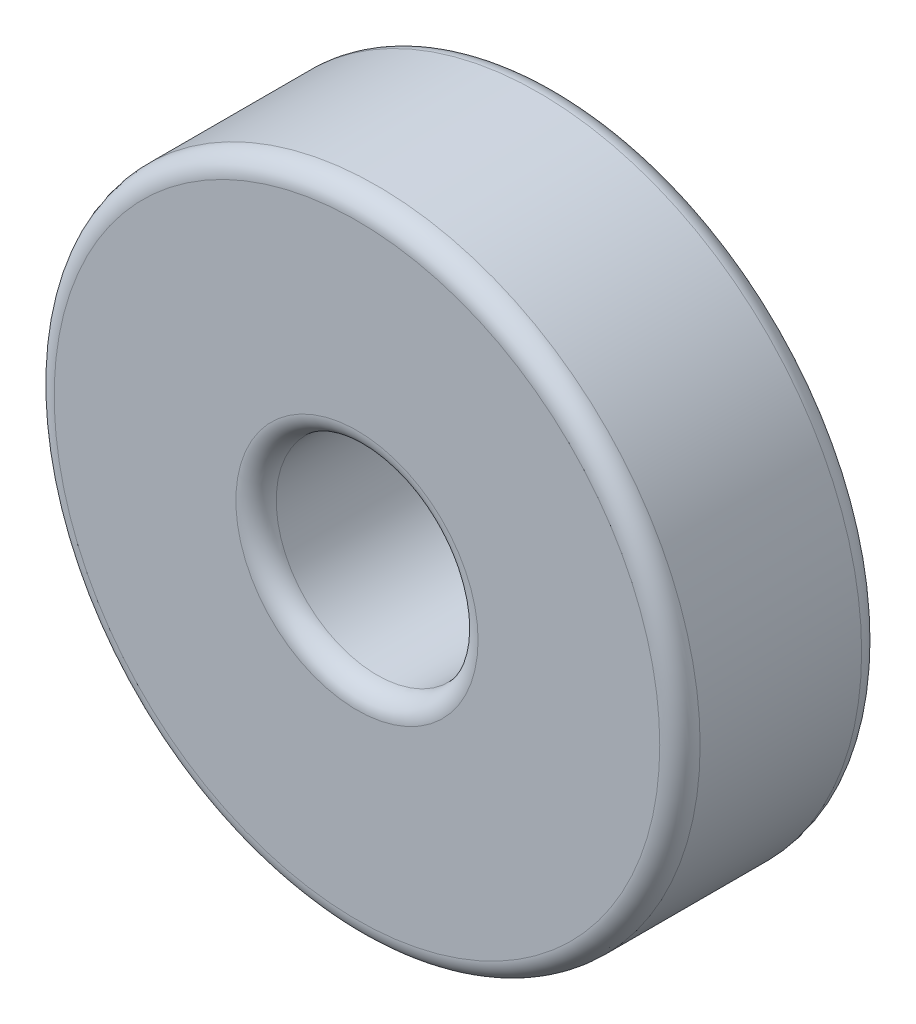
ISO-10303-21;
HEADER;
FILE_DESCRIPTION(('STEP AP214'),'2;1');
FILE_NAME('part.step','',(''),(''),'','','');
FILE_SCHEMA(('AUTOMOTIVE_DESIGN { 1 0 10303 214 1 1 1 1 }'));
ENDSEC;
DATA;
#1=APPLICATION_CONTEXT('core data for automotive mechanical design processes');
#2=APPLICATION_PROTOCOL_DEFINITION('international standard','automotive_design',2000,#1);
#3=PRODUCT_CONTEXT('',#1,'mechanical');
#4=PRODUCT('Part','Part','',(#3));
#5=PRODUCT_RELATED_PRODUCT_CATEGORY('part','',(#4));
#6=PRODUCT_DEFINITION_FORMATION('','',#4);
#7=PRODUCT_DEFINITION_CONTEXT('part definition',#1,'design');
#8=PRODUCT_DEFINITION('design','',#6,#7);
#9=PRODUCT_DEFINITION_SHAPE('','',#8);
#10=(LENGTH_UNIT() NAMED_UNIT(*) SI_UNIT(.MILLI.,.METRE.));
#11=(NAMED_UNIT(*) PLANE_ANGLE_UNIT() SI_UNIT($,.RADIAN.));
#12=(NAMED_UNIT(*) SI_UNIT($,.STERADIAN.) SOLID_ANGLE_UNIT());
#13=UNCERTAINTY_MEASURE_WITH_UNIT(LENGTH_MEASURE(1.E-05),#10,'distance_accuracy_value','');
#14=(GEOMETRIC_REPRESENTATION_CONTEXT(3) GLOBAL_UNCERTAINTY_ASSIGNED_CONTEXT((#13)) GLOBAL_UNIT_ASSIGNED_CONTEXT((#10,
#11,#12)) REPRESENTATION_CONTEXT('',''));
#15=CARTESIAN_POINT('',(0.,0.,0.));
#16=DIRECTION('',(0.,0.,1.));
#17=DIRECTION('',(1.,0.,0.));
#18=AXIS2_PLACEMENT_3D('',#15,#16,#17);
#19=CARTESIAN_POINT('',(0.,0.,5.));
#20=DIRECTION('',(0.,0.,1.));
#21=DIRECTION('',(1.,0.,0.));
#22=AXIS2_PLACEMENT_3D('',#19,#20,#21);
#23=PLANE('',#22);
#24=CARTESIAN_POINT('',(0.,0.,5.));
#25=DIRECTION('',(0.,0.,1.));
#26=DIRECTION('',(1.,0.,0.));
#27=AXIS2_PLACEMENT_3D('',#24,#25,#26);
#28=CIRCLE('',#27,3.);
#29=CARTESIAN_POINT('',(3.,0.,5.));
#30=VERTEX_POINT('',#29);
#31=EDGE_CURVE('E10',#30,#30,#28,.F.);
#32=ORIENTED_EDGE('',*,*,#31,.T.);
#33=EDGE_LOOP('',(#32));
#34=FACE_BOUND('',#33,.T.);
#35=CARTESIAN_POINT('',(0.,0.,5.));
#36=DIRECTION('',(0.,0.,1.));
#37=DIRECTION('',(1.,0.,0.));
#38=AXIS2_PLACEMENT_3D('',#35,#36,#37);
#39=CIRCLE('',#38,7.5);
#40=CARTESIAN_POINT('',(7.5,0.,5.));
#41=VERTEX_POINT('',#40);
#42=EDGE_CURVE('E50',#41,#41,#39,.T.);
#43=ORIENTED_EDGE('',*,*,#42,.T.);
#44=EDGE_LOOP('',(#43));
#45=FACE_BOUND('',#44,.T.);
#46=ADVANCED_FACE('F42',(#34,#45),#23,.T.);
#47=CARTESIAN_POINT('',(0.,0.,0.));
#48=DIRECTION('',(0.,0.,1.));
#49=DIRECTION('',(1.,0.,0.));
#50=AXIS2_PLACEMENT_3D('',#47,#48,#49);
#51=PLANE('',#50);
#52=CARTESIAN_POINT('',(0.,0.,0.));
#53=DIRECTION('',(0.,0.,1.));
#54=DIRECTION('',(1.,0.,0.));
#55=AXIS2_PLACEMENT_3D('',#52,#53,#54);
#56=CIRCLE('',#55,3.);
#57=CARTESIAN_POINT('',(3.,0.,0.));
#58=VERTEX_POINT('',#57);
#59=EDGE_CURVE('E74',#58,#58,#56,.T.);
#60=ORIENTED_EDGE('',*,*,#59,.T.);
#61=EDGE_LOOP('',(#60));
#62=FACE_BOUND('',#61,.T.);
#63=CARTESIAN_POINT('',(0.,0.,0.));
#64=DIRECTION('',(0.,0.,1.));
#65=DIRECTION('',(1.,0.,0.));
#66=AXIS2_PLACEMENT_3D('',#63,#64,#65);
#67=CIRCLE('',#66,7.5);
#68=CARTESIAN_POINT('',(7.5,0.,0.));
#69=VERTEX_POINT('',#68);
#70=EDGE_CURVE('E78',#69,#69,#67,.F.);
#71=ORIENTED_EDGE('',*,*,#70,.T.);
#72=EDGE_LOOP('',(#71));
#73=FACE_BOUND('',#72,.T.);
#74=ADVANCED_FACE('F83',(#62,#73),#51,.F.);
#75=CARTESIAN_POINT('',(0.,0.,5.));
#76=DIRECTION('',(0.,0.,-1.));
#77=DIRECTION('',(-1.,0.,0.));
#78=AXIS2_PLACEMENT_3D('',#75,#76,#77);
#79=CYLINDRICAL_SURFACE('',#78,8.);
#80=CARTESIAN_POINT('',(0.,0.,0.5));
#81=DIRECTION('',(0.,0.,1.));
#82=DIRECTION('',(1.,0.,0.));
#83=AXIS2_PLACEMENT_3D('',#80,#81,#82);
#84=CIRCLE('',#83,8.);
#85=CARTESIAN_POINT('',(8.,0.,0.5));
#86=VERTEX_POINT('',#85);
#87=EDGE_CURVE('E55',#86,#86,#84,.T.);
#88=ORIENTED_EDGE('',*,*,#87,.T.);
#89=EDGE_LOOP('',(#88));
#90=FACE_BOUND('',#89,.T.);
#91=CARTESIAN_POINT('',(0.,0.,4.5));
#92=DIRECTION('',(0.,0.,1.));
#93=DIRECTION('',(1.,0.,0.));
#94=AXIS2_PLACEMENT_3D('',#91,#92,#93);
#95=CIRCLE('',#94,8.);
#96=CARTESIAN_POINT('',(8.,0.,4.5));
#97=VERTEX_POINT('',#96);
#98=EDGE_CURVE('E60',#97,#97,#95,.F.);
#99=ORIENTED_EDGE('',*,*,#98,.T.);
#100=EDGE_LOOP('',(#99));
#101=FACE_BOUND('',#100,.T.);
#102=ADVANCED_FACE('F93',(#90,#101),#79,.T.);
#103=CARTESIAN_POINT('',(0.,0.,5.));
#104=DIRECTION('',(0.,0.,-1.));
#105=DIRECTION('',(-1.,0.,0.));
#106=AXIS2_PLACEMENT_3D('',#103,#104,#105);
#107=CYLINDRICAL_SURFACE('',#106,2.5);
#108=CARTESIAN_POINT('',(0.,0.,0.5));
#109=DIRECTION('',(0.,0.,1.));
#110=DIRECTION('',(1.,0.,0.));
#111=AXIS2_PLACEMENT_3D('',#108,#109,#110);
#112=CIRCLE('',#111,2.5);
#113=CARTESIAN_POINT('',(2.5,0.,0.5));
#114=VERTEX_POINT('',#113);
#115=EDGE_CURVE('E66',#114,#114,#112,.F.);
#116=ORIENTED_EDGE('',*,*,#115,.T.);
#117=EDGE_LOOP('',(#116));
#118=FACE_BOUND('',#117,.T.);
#119=CARTESIAN_POINT('',(0.,0.,4.5));
#120=DIRECTION('',(0.,0.,1.));
#121=DIRECTION('',(1.,0.,0.));
#122=AXIS2_PLACEMENT_3D('',#119,#120,#121);
#123=CIRCLE('',#122,2.5);
#124=CARTESIAN_POINT('',(2.5,0.,4.5));
#125=VERTEX_POINT('',#124);
#126=EDGE_CURVE('E70',#125,#125,#123,.T.);
#127=ORIENTED_EDGE('',*,*,#126,.T.);
#128=EDGE_LOOP('',(#127));
#129=FACE_BOUND('',#128,.T.);
#130=ADVANCED_FACE('F96',(#118,#129),#107,.F.);
#131=CARTESIAN_POINT('',(0.,0.,0.5));
#132=DIRECTION('',(0.,0.,1.));
#133=DIRECTION('',(1.,0.,0.));
#134=AXIS2_PLACEMENT_3D('',#131,#132,#133);
#135=TOROIDAL_SURFACE('',#134,3.,0.5);
#136=ORIENTED_EDGE('',*,*,#115,.F.);
#137=EDGE_LOOP('',(#136));
#138=FACE_BOUND('',#137,.T.);
#139=ORIENTED_EDGE('',*,*,#59,.F.);
#140=EDGE_LOOP('',(#139));
#141=FACE_BOUND('',#140,.T.);
#142=ADVANCED_FACE('F89',(#138,#141),#135,.T.);
#143=CARTESIAN_POINT('',(0.,0.,0.5));
#144=DIRECTION('',(0.,0.,1.));
#145=DIRECTION('',(1.,0.,0.));
#146=AXIS2_PLACEMENT_3D('',#143,#144,#145);
#147=TOROIDAL_SURFACE('',#146,7.5,0.5);
#148=ORIENTED_EDGE('',*,*,#70,.F.);
#149=EDGE_LOOP('',(#148));
#150=FACE_BOUND('',#149,.T.);
#151=ORIENTED_EDGE('',*,*,#87,.F.);
#152=EDGE_LOOP('',(#151));
#153=FACE_BOUND('',#152,.T.);
#154=ADVANCED_FACE('F85',(#150,#153),#147,.T.);
#155=CARTESIAN_POINT('',(0.,0.,4.5));
#156=DIRECTION('',(0.,0.,1.));
#157=DIRECTION('',(1.,0.,0.));
#158=AXIS2_PLACEMENT_3D('',#155,#156,#157);
#159=TOROIDAL_SURFACE('',#158,3.,0.5);
#160=ORIENTED_EDGE('',*,*,#31,.F.);
#161=EDGE_LOOP('',(#160));
#162=FACE_BOUND('',#161,.T.);
#163=ORIENTED_EDGE('',*,*,#126,.F.);
#164=EDGE_LOOP('',(#163));
#165=FACE_BOUND('',#164,.T.);
#166=ADVANCED_FACE('F88',(#162,#165),#159,.T.);
#167=CARTESIAN_POINT('',(0.,0.,4.5));
#168=DIRECTION('',(0.,0.,1.));
#169=DIRECTION('',(1.,0.,0.));
#170=AXIS2_PLACEMENT_3D('',#167,#168,#169);
#171=TOROIDAL_SURFACE('',#170,7.5,0.5);
#172=ORIENTED_EDGE('',*,*,#98,.F.);
#173=EDGE_LOOP('',(#172));
#174=FACE_BOUND('',#173,.T.);
#175=ORIENTED_EDGE('',*,*,#42,.F.);
#176=EDGE_LOOP('',(#175));
#177=FACE_BOUND('',#176,.T.);
#178=ADVANCED_FACE('F44',(#174,#177),#171,.T.);
#179=CLOSED_SHELL('',(#46,#74,#102,#130,#142,#154,#166,#178));
#180=MANIFOLD_SOLID_BREP('B2',#179);
#181=ADVANCED_BREP_SHAPE_REPRESENTATION('',(#18,#180),#14);
#182=SHAPE_DEFINITION_REPRESENTATION(#9,#181);
ENDSEC;
END-ISO-10303-21;
